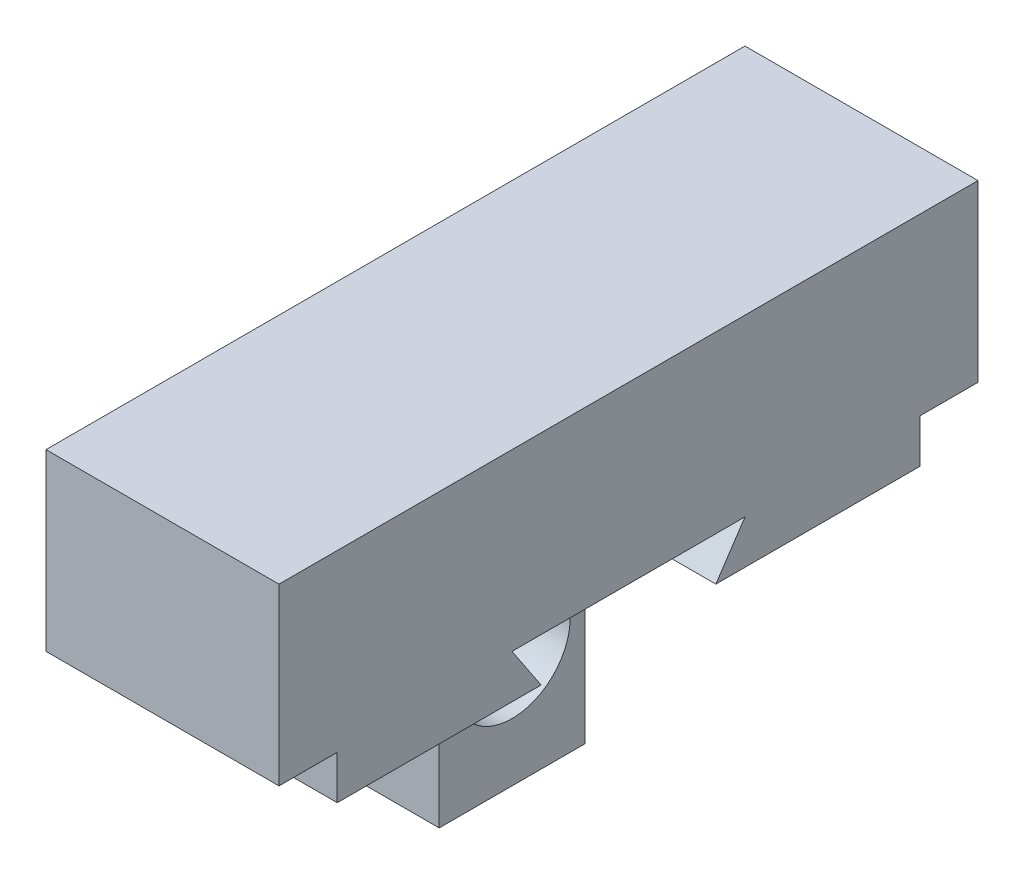
ISO-10303-21;
HEADER;
FILE_DESCRIPTION(('STEP AP214'),'2;1');
FILE_NAME('part.step','',(''),(''),'','','');
FILE_SCHEMA(('AUTOMOTIVE_DESIGN { 1 0 10303 214 1 1 1 1 }'));
ENDSEC;
DATA;
#1=APPLICATION_CONTEXT('core data for automotive mechanical design processes');
#2=APPLICATION_PROTOCOL_DEFINITION('international standard','automotive_design',2000,#1);
#3=PRODUCT_CONTEXT('',#1,'mechanical');
#4=PRODUCT('Part','Part','',(#3));
#5=PRODUCT_RELATED_PRODUCT_CATEGORY('part','',(#4));
#6=PRODUCT_DEFINITION_FORMATION('','',#4);
#7=PRODUCT_DEFINITION_CONTEXT('part definition',#1,'design');
#8=PRODUCT_DEFINITION('design','',#6,#7);
#9=PRODUCT_DEFINITION_SHAPE('','',#8);
#10=(LENGTH_UNIT() NAMED_UNIT(*) SI_UNIT(.MILLI.,.METRE.));
#11=(NAMED_UNIT(*) PLANE_ANGLE_UNIT() SI_UNIT($,.RADIAN.));
#12=(NAMED_UNIT(*) SI_UNIT($,.STERADIAN.) SOLID_ANGLE_UNIT());
#13=UNCERTAINTY_MEASURE_WITH_UNIT(LENGTH_MEASURE(1.E-05),#10,'distance_accuracy_value','');
#14=(GEOMETRIC_REPRESENTATION_CONTEXT(3) GLOBAL_UNCERTAINTY_ASSIGNED_CONTEXT((#13)) GLOBAL_UNIT_ASSIGNED_CONTEXT((#10,
#11,#12)) REPRESENTATION_CONTEXT('',''));
#15=CARTESIAN_POINT('',(0.,0.,0.));
#16=DIRECTION('',(0.,0.,1.));
#17=DIRECTION('',(1.,0.,0.));
#18=AXIS2_PLACEMENT_3D('',#15,#16,#17);
#19=CARTESIAN_POINT('',(203.2,25.4,63.5000000000001));
#20=DIRECTION('',(0.,0.,1.));
#21=DIRECTION('',(-1.,0.,0.));
#22=AXIS2_PLACEMENT_3D('',#19,#20,#21);
#23=PLANE('',#22);
#24=DIRECTION('',(0.,1.,0.));
#25=VECTOR('',#24,1.);
#26=CARTESIAN_POINT('',(254.,25.4,63.5000000000001));
#27=LINE('',#26,#25);
#28=CARTESIAN_POINT('',(254.,15.875,63.5000000000001));
#29=VERTEX_POINT('',#28);
#30=CARTESIAN_POINT('',(254.,25.4,63.5000000000001));
#31=VERTEX_POINT('',#30);
#32=EDGE_CURVE('E166',#29,#31,#27,.T.);
#33=ORIENTED_EDGE('',*,*,#32,.T.);
#34=DIRECTION('',(1.,0.,0.));
#35=VECTOR('',#34,1.);
#36=CARTESIAN_POINT('',(203.2,25.4,63.5000000000001));
#37=LINE('',#36,#35);
#38=CARTESIAN_POINT('',(203.2,25.4,63.5000000000001));
#39=VERTEX_POINT('',#38);
#40=EDGE_CURVE('E36',#39,#31,#37,.T.);
#41=ORIENTED_EDGE('',*,*,#40,.F.);
#42=DIRECTION('',(0.,1.,0.));
#43=VECTOR('',#42,1.);
#44=CARTESIAN_POINT('',(203.2,25.4,63.5000000000001));
#45=LINE('',#44,#43);
#46=CARTESIAN_POINT('',(203.2,15.875,63.5000000000001));
#47=VERTEX_POINT('',#46);
#48=EDGE_CURVE('E189',#47,#39,#45,.T.);
#49=ORIENTED_EDGE('',*,*,#48,.F.);
#50=DIRECTION('',(1.,0.,0.));
#51=VECTOR('',#50,1.);
#52=CARTESIAN_POINT('',(203.2,15.875,63.5000000000001));
#53=LINE('',#52,#51);
#54=EDGE_CURVE('E11',#47,#29,#53,.T.);
#55=ORIENTED_EDGE('',*,*,#54,.T.);
#56=EDGE_LOOP('',(#33,#41,#49,#55));
#57=FACE_BOUND('',#56,.T.);
#58=ADVANCED_FACE('F33',(#57),#23,.T.);
#59=CARTESIAN_POINT('',(203.2,15.875,63.5000000000001));
#60=DIRECTION('',(0.,-1.,0.));
#61=DIRECTION('',(0.,0.,-1.));
#62=AXIS2_PLACEMENT_3D('',#59,#60,#61);
#63=PLANE('',#62);
#64=DIRECTION('',(0.,0.,1.));
#65=VECTOR('',#64,1.);
#66=CARTESIAN_POINT('',(254.,15.875,63.5000000000001));
#67=LINE('',#66,#65);
#68=CARTESIAN_POINT('',(254.,15.875,19.05));
#69=VERTEX_POINT('',#68);
#70=EDGE_CURVE('E102',#69,#29,#67,.T.);
#71=ORIENTED_EDGE('',*,*,#70,.T.);
#72=ORIENTED_EDGE('',*,*,#54,.F.);
#73=DIRECTION('',(0.,0.,1.));
#74=VECTOR('',#73,1.);
#75=CARTESIAN_POINT('',(203.2,15.875,63.5000000000001));
#76=LINE('',#75,#74);
#77=CARTESIAN_POINT('',(203.2,15.875,19.05));
#78=VERTEX_POINT('',#77);
#79=EDGE_CURVE('E57',#78,#47,#76,.T.);
#80=ORIENTED_EDGE('',*,*,#79,.F.);
#81=DIRECTION('',(1.,0.,0.));
#82=VECTOR('',#81,1.);
#83=CARTESIAN_POINT('',(203.2,15.875,19.05));
#84=LINE('',#83,#82);
#85=EDGE_CURVE('E41',#78,#69,#84,.T.);
#86=ORIENTED_EDGE('',*,*,#85,.T.);
#87=EDGE_LOOP('',(#71,#72,#80,#86));
#88=FACE_BOUND('',#87,.T.);
#89=ADVANCED_FACE('F318',(#88),#63,.T.);
#90=CARTESIAN_POINT('',(203.2,15.875,19.05));
#91=DIRECTION('',(0.,0.554700196225229,-0.832050294337844));
#92=DIRECTION('',(0.,0.832050294337844,0.554700196225229));
#93=AXIS2_PLACEMENT_3D('',#90,#91,#92);
#94=PLANE('',#93);
#95=DIRECTION('',(0.,-0.832050294337844,-0.554700196225229));
#96=VECTOR('',#95,1.);
#97=CARTESIAN_POINT('',(254.,15.875,19.05));
#98=LINE('',#97,#96);
#99=CARTESIAN_POINT('',(254.,25.4,25.4));
#100=VERTEX_POINT('',#99);
#101=EDGE_CURVE('E187',#100,#69,#98,.T.);
#102=ORIENTED_EDGE('',*,*,#101,.T.);
#103=ORIENTED_EDGE('',*,*,#85,.F.);
#104=DIRECTION('',(0.,-0.832050294337844,-0.554700196225229));
#105=VECTOR('',#104,1.);
#106=CARTESIAN_POINT('',(203.2,15.875,19.05));
#107=LINE('',#106,#105);
#108=CARTESIAN_POINT('',(203.2,25.4,25.4));
#109=VERTEX_POINT('',#108);
#110=EDGE_CURVE('E142',#109,#78,#107,.T.);
#111=ORIENTED_EDGE('',*,*,#110,.F.);
#112=DIRECTION('',(1.,0.,0.));
#113=VECTOR('',#112,1.);
#114=CARTESIAN_POINT('',(203.2,25.4,25.4));
#115=LINE('',#114,#113);
#116=EDGE_CURVE('E150',#109,#100,#115,.T.);
#117=ORIENTED_EDGE('',*,*,#116,.T.);
#118=EDGE_LOOP('',(#102,#103,#111,#117));
#119=FACE_BOUND('',#118,.T.);
#120=ADVANCED_FACE('F160',(#119),#94,.T.);
#121=CARTESIAN_POINT('',(203.2,25.4,-25.4));
#122=DIRECTION('',(0.,-1.,0.));
#123=DIRECTION('',(0.,0.,-1.));
#124=AXIS2_PLACEMENT_3D('',#121,#122,#123);
#125=PLANE('',#124);
#126=DIRECTION('',(-1.,0.,0.));
#127=VECTOR('',#126,1.);
#128=CARTESIAN_POINT('',(228.6,25.4,-15.875));
#129=LINE('',#128,#127);
#130=CARTESIAN_POINT('',(228.6,25.4,-15.875));
#131=VERTEX_POINT('',#130);
#132=CARTESIAN_POINT('',(203.2,25.4,-15.875));
#133=VERTEX_POINT('',#132);
#134=EDGE_CURVE('E170',#131,#133,#129,.T.);
#135=ORIENTED_EDGE('',*,*,#134,.T.);
#136=DIRECTION('',(0.,0.,1.));
#137=VECTOR('',#136,1.);
#138=CARTESIAN_POINT('',(203.2,25.4,-25.4));
#139=LINE('',#138,#137);
#140=CARTESIAN_POINT('',(203.2,25.4,-25.4));
#141=VERTEX_POINT('',#140);
#142=EDGE_CURVE('E146',#141,#133,#139,.T.);
#143=ORIENTED_EDGE('',*,*,#142,.F.);
#144=DIRECTION('',(1.,0.,0.));
#145=VECTOR('',#144,1.);
#146=CARTESIAN_POINT('',(203.2,25.4,-25.4));
#147=LINE('',#146,#145);
#148=CARTESIAN_POINT('',(254.,25.4,-25.4));
#149=VERTEX_POINT('',#148);
#150=EDGE_CURVE('E158',#141,#149,#147,.T.);
#151=ORIENTED_EDGE('',*,*,#150,.T.);
#152=DIRECTION('',(0.,0.,1.));
#153=VECTOR('',#152,1.);
#154=CARTESIAN_POINT('',(254.,25.4,-25.4));
#155=LINE('',#154,#153);
#156=EDGE_CURVE('E155',#149,#100,#155,.T.);
#157=ORIENTED_EDGE('',*,*,#156,.T.);
#158=ORIENTED_EDGE('',*,*,#116,.F.);
#159=CARTESIAN_POINT('',(203.2,25.4,15.875));
#160=VERTEX_POINT('',#159);
#161=EDGE_CURVE('E137',#160,#109,#139,.T.);
#162=ORIENTED_EDGE('',*,*,#161,.F.);
#163=DIRECTION('',(-1.,0.,0.));
#164=VECTOR('',#163,1.);
#165=CARTESIAN_POINT('',(228.6,25.4,15.875));
#166=LINE('',#165,#164);
#167=CARTESIAN_POINT('',(228.6,25.4,15.875));
#168=VERTEX_POINT('',#167);
#169=EDGE_CURVE('E263',#168,#160,#166,.T.);
#170=ORIENTED_EDGE('',*,*,#169,.F.);
#171=DIRECTION('',(0.,0.,-1.));
#172=VECTOR('',#171,1.);
#173=CARTESIAN_POINT('',(228.6,25.4,-15.875));
#174=LINE('',#173,#172);
#175=EDGE_CURVE('E256',#168,#131,#174,.T.);
#176=ORIENTED_EDGE('',*,*,#175,.T.);
#177=EDGE_LOOP('',(#135,#143,#151,#157,#158,#162,#170,#176));
#178=FACE_BOUND('',#177,.T.);
#179=ADVANCED_FACE('F152',(#178),#125,.T.);
#180=CARTESIAN_POINT('',(203.2,25.4,-25.4));
#181=DIRECTION('',(0.,0.554700196225229,0.832050294337844));
#182=DIRECTION('',(0.,-0.832050294337844,0.554700196225229));
#183=AXIS2_PLACEMENT_3D('',#180,#181,#182);
#184=PLANE('',#183);
#185=DIRECTION('',(0.,0.832050294337844,-0.554700196225229));
#186=VECTOR('',#185,1.);
#187=CARTESIAN_POINT('',(254.,25.4,-25.4));
#188=LINE('',#187,#186);
#189=CARTESIAN_POINT('',(254.,15.875,-19.05));
#190=VERTEX_POINT('',#189);
#191=EDGE_CURVE('E184',#190,#149,#188,.T.);
#192=ORIENTED_EDGE('',*,*,#191,.T.);
#193=ORIENTED_EDGE('',*,*,#150,.F.);
#194=DIRECTION('',(0.,0.832050294337844,-0.554700196225229));
#195=VECTOR('',#194,1.);
#196=CARTESIAN_POINT('',(203.2,25.4,-25.4));
#197=LINE('',#196,#195);
#198=CARTESIAN_POINT('',(203.2,15.875,-19.05));
#199=VERTEX_POINT('',#198);
#200=EDGE_CURVE('E147',#199,#141,#197,.T.);
#201=ORIENTED_EDGE('',*,*,#200,.F.);
#202=DIRECTION('',(1.,0.,0.));
#203=VECTOR('',#202,1.);
#204=CARTESIAN_POINT('',(203.2,15.875,-19.05));
#205=LINE('',#204,#203);
#206=EDGE_CURVE('E193',#199,#190,#205,.T.);
#207=ORIENTED_EDGE('',*,*,#206,.T.);
#208=EDGE_LOOP('',(#192,#193,#201,#207));
#209=FACE_BOUND('',#208,.T.);
#210=ADVANCED_FACE('F251',(#209),#184,.T.);
#211=CARTESIAN_POINT('',(203.2,15.875,-19.05));
#212=DIRECTION('',(0.,-1.,0.));
#213=DIRECTION('',(0.,0.,-1.));
#214=AXIS2_PLACEMENT_3D('',#211,#212,#213);
#215=PLANE('',#214);
#216=DIRECTION('',(0.,0.,1.));
#217=VECTOR('',#216,1.);
#218=CARTESIAN_POINT('',(254.,15.875,-19.05));
#219=LINE('',#218,#217);
#220=CARTESIAN_POINT('',(254.,15.875,-63.5));
#221=VERTEX_POINT('',#220);
#222=EDGE_CURVE('E182',#221,#190,#219,.T.);
#223=ORIENTED_EDGE('',*,*,#222,.T.);
#224=ORIENTED_EDGE('',*,*,#206,.F.);
#225=DIRECTION('',(0.,0.,1.));
#226=VECTOR('',#225,1.);
#227=CARTESIAN_POINT('',(203.2,15.875,-19.05));
#228=LINE('',#227,#226);
#229=CARTESIAN_POINT('',(203.2,15.875,-63.5));
#230=VERTEX_POINT('',#229);
#231=EDGE_CURVE('E243',#230,#199,#228,.T.);
#232=ORIENTED_EDGE('',*,*,#231,.F.);
#233=DIRECTION('',(1.,0.,0.));
#234=VECTOR('',#233,1.);
#235=CARTESIAN_POINT('',(203.2,15.875,-63.5));
#236=LINE('',#235,#234);
#237=EDGE_CURVE('E196',#230,#221,#236,.T.);
#238=ORIENTED_EDGE('',*,*,#237,.T.);
#239=EDGE_LOOP('',(#223,#224,#232,#238));
#240=FACE_BOUND('',#239,.T.);
#241=ADVANCED_FACE('F334',(#240),#215,.T.);
#242=CARTESIAN_POINT('',(203.2,15.875,-63.5));
#243=DIRECTION('',(0.,0.,-1.));
#244=DIRECTION('',(1.,0.,0.));
#245=AXIS2_PLACEMENT_3D('',#242,#243,#244);
#246=PLANE('',#245);
#247=DIRECTION('',(0.,-1.,0.));
#248=VECTOR('',#247,1.);
#249=CARTESIAN_POINT('',(254.,15.875,-63.5));
#250=LINE('',#249,#248);
#251=CARTESIAN_POINT('',(254.,25.4,-63.5));
#252=VERTEX_POINT('',#251);
#253=EDGE_CURVE('E180',#252,#221,#250,.T.);
#254=ORIENTED_EDGE('',*,*,#253,.T.);
#255=ORIENTED_EDGE('',*,*,#237,.F.);
#256=DIRECTION('',(0.,-1.,0.));
#257=VECTOR('',#256,1.);
#258=CARTESIAN_POINT('',(203.2,15.875,-63.5));
#259=LINE('',#258,#257);
#260=CARTESIAN_POINT('',(203.2,25.4,-63.5));
#261=VERTEX_POINT('',#260);
#262=EDGE_CURVE('E241',#261,#230,#259,.T.);
#263=ORIENTED_EDGE('',*,*,#262,.F.);
#264=DIRECTION('',(1.,0.,0.));
#265=VECTOR('',#264,1.);
#266=CARTESIAN_POINT('',(203.2,25.4,-63.5));
#267=LINE('',#266,#265);
#268=EDGE_CURVE('E199',#261,#252,#267,.T.);
#269=ORIENTED_EDGE('',*,*,#268,.T.);
#270=EDGE_LOOP('',(#254,#255,#263,#269));
#271=FACE_BOUND('',#270,.T.);
#272=ADVANCED_FACE('F337',(#271),#246,.T.);
#273=CARTESIAN_POINT('',(203.2,25.4,-63.5));
#274=DIRECTION('',(0.,-1.,0.));
#275=DIRECTION('',(0.,0.,-1.));
#276=AXIS2_PLACEMENT_3D('',#273,#274,#275);
#277=PLANE('',#276);
#278=DIRECTION('',(0.,0.,1.));
#279=VECTOR('',#278,1.);
#280=CARTESIAN_POINT('',(254.,25.4,-63.5));
#281=LINE('',#280,#279);
#282=CARTESIAN_POINT('',(254.,25.4,-76.2));
#283=VERTEX_POINT('',#282);
#284=EDGE_CURVE('E178',#283,#252,#281,.T.);
#285=ORIENTED_EDGE('',*,*,#284,.T.);
#286=ORIENTED_EDGE('',*,*,#268,.F.);
#287=DIRECTION('',(0.,0.,1.));
#288=VECTOR('',#287,1.);
#289=CARTESIAN_POINT('',(203.2,25.4,-63.5));
#290=LINE('',#289,#288);
#291=CARTESIAN_POINT('',(203.2,25.4,-76.2));
#292=VERTEX_POINT('',#291);
#293=EDGE_CURVE('E235',#292,#261,#290,.T.);
#294=ORIENTED_EDGE('',*,*,#293,.F.);
#295=DIRECTION('',(1.,0.,0.));
#296=VECTOR('',#295,1.);
#297=CARTESIAN_POINT('',(203.2,25.4,-76.2));
#298=LINE('',#297,#296);
#299=EDGE_CURVE('E202',#292,#283,#298,.T.);
#300=ORIENTED_EDGE('',*,*,#299,.T.);
#301=EDGE_LOOP('',(#285,#286,#294,#300));
#302=FACE_BOUND('',#301,.T.);
#303=ADVANCED_FACE('F341',(#302),#277,.T.);
#304=CARTESIAN_POINT('',(203.2,25.4,-76.2));
#305=DIRECTION('',(0.,0.,-1.));
#306=DIRECTION('',(1.,0.,0.));
#307=AXIS2_PLACEMENT_3D('',#304,#305,#306);
#308=PLANE('',#307);
#309=DIRECTION('',(0.,-1.,0.));
#310=VECTOR('',#309,1.);
#311=CARTESIAN_POINT('',(254.,25.4,-76.2));
#312=LINE('',#311,#310);
#313=CARTESIAN_POINT('',(254.,63.5,-76.2));
#314=VERTEX_POINT('',#313);
#315=EDGE_CURVE('E176',#314,#283,#312,.T.);
#316=ORIENTED_EDGE('',*,*,#315,.T.);
#317=ORIENTED_EDGE('',*,*,#299,.F.);
#318=DIRECTION('',(0.,-1.,0.));
#319=VECTOR('',#318,1.);
#320=CARTESIAN_POINT('',(203.2,25.4,-76.2));
#321=LINE('',#320,#319);
#322=CARTESIAN_POINT('',(203.2,63.5,-76.2));
#323=VERTEX_POINT('',#322);
#324=EDGE_CURVE('E232',#323,#292,#321,.T.);
#325=ORIENTED_EDGE('',*,*,#324,.F.);
#326=DIRECTION('',(1.,0.,0.));
#327=VECTOR('',#326,1.);
#328=CARTESIAN_POINT('',(203.2,63.5,-76.2));
#329=LINE('',#328,#327);
#330=EDGE_CURVE('E205',#323,#314,#329,.T.);
#331=ORIENTED_EDGE('',*,*,#330,.T.);
#332=EDGE_LOOP('',(#316,#317,#325,#331));
#333=FACE_BOUND('',#332,.T.);
#334=ADVANCED_FACE('F345',(#333),#308,.T.);
#335=CARTESIAN_POINT('',(203.2,63.5,-76.2));
#336=DIRECTION('',(0.,1.,0.));
#337=DIRECTION('',(0.,0.,1.));
#338=AXIS2_PLACEMENT_3D('',#335,#336,#337);
#339=PLANE('',#338);
#340=DIRECTION('',(0.,0.,-1.));
#341=VECTOR('',#340,1.);
#342=CARTESIAN_POINT('',(254.,63.5,-76.2));
#343=LINE('',#342,#341);
#344=CARTESIAN_POINT('',(254.,63.5,76.2));
#345=VERTEX_POINT('',#344);
#346=EDGE_CURVE('E174',#345,#314,#343,.T.);
#347=ORIENTED_EDGE('',*,*,#346,.T.);
#348=ORIENTED_EDGE('',*,*,#330,.F.);
#349=DIRECTION('',(0.,0.,-1.));
#350=VECTOR('',#349,1.);
#351=CARTESIAN_POINT('',(203.2,63.5,-76.2));
#352=LINE('',#351,#350);
#353=CARTESIAN_POINT('',(203.2,63.5,76.2));
#354=VERTEX_POINT('',#353);
#355=EDGE_CURVE('E230',#354,#323,#352,.T.);
#356=ORIENTED_EDGE('',*,*,#355,.F.);
#357=DIRECTION('',(1.,0.,0.));
#358=VECTOR('',#357,1.);
#359=CARTESIAN_POINT('',(203.2,63.5,76.2));
#360=LINE('',#359,#358);
#361=EDGE_CURVE('E208',#354,#345,#360,.T.);
#362=ORIENTED_EDGE('',*,*,#361,.T.);
#363=EDGE_LOOP('',(#347,#348,#356,#362));
#364=FACE_BOUND('',#363,.T.);
#365=ADVANCED_FACE('F228',(#364),#339,.T.);
#366=CARTESIAN_POINT('',(203.2,63.5,76.2));
#367=DIRECTION('',(0.,0.,1.));
#368=DIRECTION('',(-1.,0.,0.));
#369=AXIS2_PLACEMENT_3D('',#366,#367,#368);
#370=PLANE('',#369);
#371=DIRECTION('',(0.,1.,0.));
#372=VECTOR('',#371,1.);
#373=CARTESIAN_POINT('',(254.,63.5,76.2));
#374=LINE('',#373,#372);
#375=CARTESIAN_POINT('',(254.,25.4,76.2));
#376=VERTEX_POINT('',#375);
#377=EDGE_CURVE('E172',#376,#345,#374,.T.);
#378=ORIENTED_EDGE('',*,*,#377,.T.);
#379=ORIENTED_EDGE('',*,*,#361,.F.);
#380=DIRECTION('',(0.,1.,0.));
#381=VECTOR('',#380,1.);
#382=CARTESIAN_POINT('',(203.2,63.5,76.2));
#383=LINE('',#382,#381);
#384=CARTESIAN_POINT('',(203.2,25.4,76.2));
#385=VERTEX_POINT('',#384);
#386=EDGE_CURVE('E233',#385,#354,#383,.T.);
#387=ORIENTED_EDGE('',*,*,#386,.F.);
#388=DIRECTION('',(1.,0.,0.));
#389=VECTOR('',#388,1.);
#390=CARTESIAN_POINT('',(203.2,25.4,76.2));
#391=LINE('',#390,#389);
#392=EDGE_CURVE('E210',#385,#376,#391,.T.);
#393=ORIENTED_EDGE('',*,*,#392,.T.);
#394=EDGE_LOOP('',(#378,#379,#387,#393));
#395=FACE_BOUND('',#394,.T.);
#396=ADVANCED_FACE('F225',(#395),#370,.T.);
#397=CARTESIAN_POINT('',(203.2,25.4,76.2));
#398=DIRECTION('',(0.,-1.,0.));
#399=DIRECTION('',(0.,0.,-1.));
#400=AXIS2_PLACEMENT_3D('',#397,#398,#399);
#401=PLANE('',#400);
#402=DIRECTION('',(0.,0.,1.));
#403=VECTOR('',#402,1.);
#404=CARTESIAN_POINT('',(254.,25.4,76.2));
#405=LINE('',#404,#403);
#406=EDGE_CURVE('E169',#31,#376,#405,.T.);
#407=ORIENTED_EDGE('',*,*,#406,.T.);
#408=ORIENTED_EDGE('',*,*,#392,.F.);
#409=DIRECTION('',(0.,0.,1.));
#410=VECTOR('',#409,1.);
#411=CARTESIAN_POINT('',(203.2,25.4,76.2));
#412=LINE('',#411,#410);
#413=EDGE_CURVE('E110',#39,#385,#412,.T.);
#414=ORIENTED_EDGE('',*,*,#413,.F.);
#415=ORIENTED_EDGE('',*,*,#40,.T.);
#416=EDGE_LOOP('',(#407,#408,#414,#415));
#417=FACE_BOUND('',#416,.T.);
#418=ADVANCED_FACE('F216',(#417),#401,.T.);
#419=CARTESIAN_POINT('',(203.2,0.,0.));
#420=DIRECTION('',(-1.,0.,0.));
#421=DIRECTION('',(0.,0.,-1.));
#422=AXIS2_PLACEMENT_3D('',#419,#420,#421);
#423=PLANE('',#422);
#424=ORIENTED_EDGE('',*,*,#48,.T.);
#425=ORIENTED_EDGE('',*,*,#413,.T.);
#426=ORIENTED_EDGE('',*,*,#386,.T.);
#427=ORIENTED_EDGE('',*,*,#355,.T.);
#428=ORIENTED_EDGE('',*,*,#324,.T.);
#429=ORIENTED_EDGE('',*,*,#293,.T.);
#430=ORIENTED_EDGE('',*,*,#262,.T.);
#431=ORIENTED_EDGE('',*,*,#231,.T.);
#432=ORIENTED_EDGE('',*,*,#200,.T.);
#433=ORIENTED_EDGE('',*,*,#142,.T.);
#434=DIRECTION('',(0.,-1.,0.));
#435=VECTOR('',#434,1.);
#436=CARTESIAN_POINT('',(203.2,25.4,-15.875));
#437=LINE('',#436,#435);
#438=CARTESIAN_POINT('',(203.2,-25.4,-15.875));
#439=VERTEX_POINT('',#438);
#440=EDGE_CURVE('E285',#133,#439,#437,.T.);
#441=ORIENTED_EDGE('',*,*,#440,.T.);
#442=DIRECTION('',(0.,0.,1.));
#443=VECTOR('',#442,1.);
#444=CARTESIAN_POINT('',(203.2,-25.4,15.875));
#445=LINE('',#444,#443);
#446=CARTESIAN_POINT('',(203.2,-25.4,15.875));
#447=VERTEX_POINT('',#446);
#448=EDGE_CURVE('E286',#439,#447,#445,.T.);
#449=ORIENTED_EDGE('',*,*,#448,.T.);
#450=DIRECTION('',(0.,1.,0.));
#451=VECTOR('',#450,1.);
#452=CARTESIAN_POINT('',(203.2,-25.4,15.875));
#453=LINE('',#452,#451);
#454=EDGE_CURVE('E49',#447,#160,#453,.T.);
#455=ORIENTED_EDGE('',*,*,#454,.T.);
#456=ORIENTED_EDGE('',*,*,#161,.T.);
#457=ORIENTED_EDGE('',*,*,#110,.T.);
#458=ORIENTED_EDGE('',*,*,#79,.T.);
#459=EDGE_LOOP('',(#424,#425,#426,#427,#428,#429,#430,#431,#432,#433,#441,#449,#455,#456,#457,#458));
#460=FACE_BOUND('',#459,.T.);
#461=CARTESIAN_POINT('',(203.2,0.,0.));
#462=DIRECTION('',(-1.,0.,0.));
#463=DIRECTION('',(0.,0.,1.));
#464=AXIS2_PLACEMENT_3D('',#461,#462,#463);
#465=CIRCLE('',#464,12.7);
#466=CARTESIAN_POINT('',(203.2,0.,12.7));
#467=VERTEX_POINT('',#466);
#468=EDGE_CURVE('E292',#467,#467,#465,.T.);
#469=ORIENTED_EDGE('',*,*,#468,.F.);
#470=EDGE_LOOP('',(#469));
#471=FACE_BOUND('',#470,.T.);
#472=ADVANCED_FACE('F139',(#460,#471),#423,.T.);
#473=CARTESIAN_POINT('',(254.,0.,0.));
#474=DIRECTION('',(-1.,0.,0.));
#475=DIRECTION('',(0.,0.,-1.));
#476=AXIS2_PLACEMENT_3D('',#473,#474,#475);
#477=PLANE('',#476);
#478=ORIENTED_EDGE('',*,*,#32,.F.);
#479=ORIENTED_EDGE('',*,*,#70,.F.);
#480=ORIENTED_EDGE('',*,*,#101,.F.);
#481=ORIENTED_EDGE('',*,*,#156,.F.);
#482=ORIENTED_EDGE('',*,*,#191,.F.);
#483=ORIENTED_EDGE('',*,*,#222,.F.);
#484=ORIENTED_EDGE('',*,*,#253,.F.);
#485=ORIENTED_EDGE('',*,*,#284,.F.);
#486=ORIENTED_EDGE('',*,*,#315,.F.);
#487=ORIENTED_EDGE('',*,*,#346,.F.);
#488=ORIENTED_EDGE('',*,*,#377,.F.);
#489=ORIENTED_EDGE('',*,*,#406,.F.);
#490=EDGE_LOOP('',(#478,#479,#480,#481,#482,#483,#484,#485,#486,#487,#488,#489));
#491=FACE_BOUND('',#490,.T.);
#492=ADVANCED_FACE('F221',(#491),#477,.F.);
#493=CARTESIAN_POINT('',(228.6,25.4,-15.875));
#494=DIRECTION('',(0.,0.,-1.));
#495=DIRECTION('',(0.,1.,0.));
#496=AXIS2_PLACEMENT_3D('',#493,#494,#495);
#497=PLANE('',#496);
#498=ORIENTED_EDGE('',*,*,#440,.F.);
#499=ORIENTED_EDGE('',*,*,#134,.F.);
#500=DIRECTION('',(0.,-1.,0.));
#501=VECTOR('',#500,1.);
#502=CARTESIAN_POINT('',(228.6,25.4,-15.875));
#503=LINE('',#502,#501);
#504=CARTESIAN_POINT('',(228.6,-25.4,-15.875));
#505=VERTEX_POINT('',#504);
#506=EDGE_CURVE('E288',#131,#505,#503,.T.);
#507=ORIENTED_EDGE('',*,*,#506,.T.);
#508=DIRECTION('',(-1.,0.,0.));
#509=VECTOR('',#508,1.);
#510=CARTESIAN_POINT('',(228.6,-25.4,-15.875));
#511=LINE('',#510,#509);
#512=EDGE_CURVE('E272',#505,#439,#511,.T.);
#513=ORIENTED_EDGE('',*,*,#512,.T.);
#514=EDGE_LOOP('',(#498,#499,#507,#513));
#515=FACE_BOUND('',#514,.T.);
#516=ADVANCED_FACE('F313',(#515),#497,.T.);
#517=CARTESIAN_POINT('',(228.6,-25.4,15.875));
#518=DIRECTION('',(0.,0.,1.));
#519=DIRECTION('',(1.,0.,0.));
#520=AXIS2_PLACEMENT_3D('',#517,#518,#519);
#521=PLANE('',#520);
#522=ORIENTED_EDGE('',*,*,#454,.F.);
#523=DIRECTION('',(-1.,0.,0.));
#524=VECTOR('',#523,1.);
#525=CARTESIAN_POINT('',(228.6,-25.4,15.875));
#526=LINE('',#525,#524);
#527=CARTESIAN_POINT('',(228.6,-25.4,15.875));
#528=VERTEX_POINT('',#527);
#529=EDGE_CURVE('E265',#528,#447,#526,.T.);
#530=ORIENTED_EDGE('',*,*,#529,.F.);
#531=DIRECTION('',(0.,1.,0.));
#532=VECTOR('',#531,1.);
#533=CARTESIAN_POINT('',(228.6,-25.4,15.875));
#534=LINE('',#533,#532);
#535=EDGE_CURVE('E278',#528,#168,#534,.T.);
#536=ORIENTED_EDGE('',*,*,#535,.T.);
#537=ORIENTED_EDGE('',*,*,#169,.T.);
#538=EDGE_LOOP('',(#522,#530,#536,#537));
#539=FACE_BOUND('',#538,.T.);
#540=ADVANCED_FACE('F383',(#539),#521,.T.);
#541=CARTESIAN_POINT('',(228.6,-25.4,15.875));
#542=DIRECTION('',(0.,-1.,0.));
#543=DIRECTION('',(0.,0.,-1.));
#544=AXIS2_PLACEMENT_3D('',#541,#542,#543);
#545=PLANE('',#544);
#546=ORIENTED_EDGE('',*,*,#448,.F.);
#547=ORIENTED_EDGE('',*,*,#512,.F.);
#548=DIRECTION('',(0.,0.,1.));
#549=VECTOR('',#548,1.);
#550=CARTESIAN_POINT('',(228.6,-25.4,15.875));
#551=LINE('',#550,#549);
#552=EDGE_CURVE('E281',#505,#528,#551,.T.);
#553=ORIENTED_EDGE('',*,*,#552,.T.);
#554=ORIENTED_EDGE('',*,*,#529,.T.);
#555=EDGE_LOOP('',(#546,#547,#553,#554));
#556=FACE_BOUND('',#555,.T.);
#557=ADVANCED_FACE('F391',(#556),#545,.T.);
#558=CARTESIAN_POINT('',(228.6,0.,0.));
#559=DIRECTION('',(1.,0.,0.));
#560=DIRECTION('',(0.,0.,-1.));
#561=AXIS2_PLACEMENT_3D('',#558,#559,#560);
#562=PLANE('',#561);
#563=CARTESIAN_POINT('',(228.6,0.,0.));
#564=DIRECTION('',(-1.,0.,0.));
#565=DIRECTION('',(0.,0.,1.));
#566=AXIS2_PLACEMENT_3D('',#563,#564,#565);
#567=CIRCLE('',#566,12.7);
#568=CARTESIAN_POINT('',(228.6,0.,12.7));
#569=VERTEX_POINT('',#568);
#570=EDGE_CURVE('E287',#569,#569,#567,.T.);
#571=ORIENTED_EDGE('',*,*,#570,.T.);
#572=EDGE_LOOP('',(#571));
#573=FACE_BOUND('',#572,.T.);
#574=ORIENTED_EDGE('',*,*,#506,.F.);
#575=ORIENTED_EDGE('',*,*,#175,.F.);
#576=ORIENTED_EDGE('',*,*,#535,.F.);
#577=ORIENTED_EDGE('',*,*,#552,.F.);
#578=EDGE_LOOP('',(#574,#575,#576,#577));
#579=FACE_BOUND('',#578,.T.);
#580=ADVANCED_FACE('F298',(#573,#579),#562,.T.);
#581=CARTESIAN_POINT('',(228.6,0.,0.));
#582=DIRECTION('',(-1.,0.,0.));
#583=DIRECTION('',(0.,0.,1.));
#584=AXIS2_PLACEMENT_3D('',#581,#582,#583);
#585=CYLINDRICAL_SURFACE('',#584,12.7);
#586=ORIENTED_EDGE('',*,*,#570,.F.);
#587=EDGE_LOOP('',(#586));
#588=FACE_BOUND('',#587,.T.);
#589=ORIENTED_EDGE('',*,*,#468,.T.);
#590=EDGE_LOOP('',(#589));
#591=FACE_BOUND('',#590,.T.);
#592=ADVANCED_FACE('F301',(#588,#591),#585,.F.);
#593=CLOSED_SHELL('',(#58,#89,#120,#179,#210,#241,#272,#303,#334,#365,#396,#418,#472,#492,#516,
#540,#557,#580,#592));
#594=MANIFOLD_SOLID_BREP('B2',#593);
#595=ADVANCED_BREP_SHAPE_REPRESENTATION('',(#18,#594),#14);
#596=SHAPE_DEFINITION_REPRESENTATION(#9,#595);
ENDSEC;
END-ISO-10303-21;
